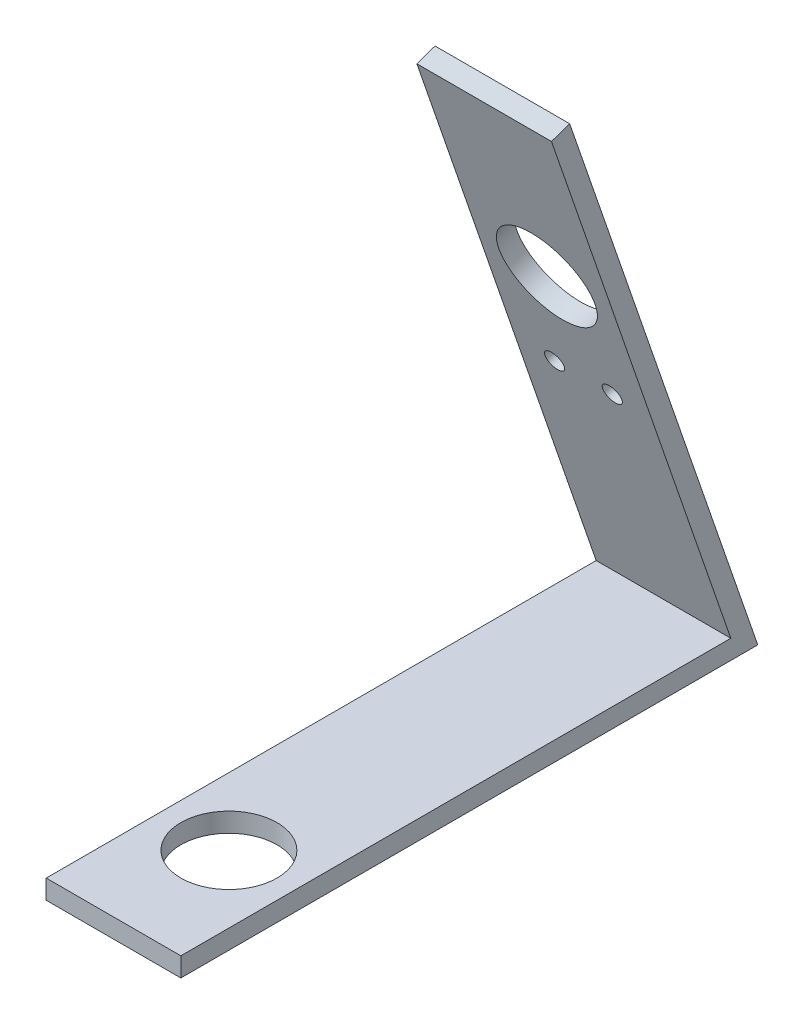
ISO-10303-21;
HEADER;
FILE_DESCRIPTION(('STEP AP214'),'2;1');
FILE_NAME('part.step','',(''),(''),'','','');
FILE_SCHEMA(('AUTOMOTIVE_DESIGN { 1 0 10303 214 1 1 1 1 }'));
ENDSEC;
DATA;
#1=APPLICATION_CONTEXT('core data for automotive mechanical design processes');
#2=APPLICATION_PROTOCOL_DEFINITION('international standard','automotive_design',2000,#1);
#3=PRODUCT_CONTEXT('',#1,'mechanical');
#4=PRODUCT('Part','Part','',(#3));
#5=PRODUCT_RELATED_PRODUCT_CATEGORY('part','',(#4));
#6=PRODUCT_DEFINITION_FORMATION('','',#4);
#7=PRODUCT_DEFINITION_CONTEXT('part definition',#1,'design');
#8=PRODUCT_DEFINITION('design','',#6,#7);
#9=PRODUCT_DEFINITION_SHAPE('','',#8);
#10=(LENGTH_UNIT() NAMED_UNIT(*) SI_UNIT(.MILLI.,.METRE.));
#11=(NAMED_UNIT(*) PLANE_ANGLE_UNIT() SI_UNIT($,.RADIAN.));
#12=(NAMED_UNIT(*) SI_UNIT($,.STERADIAN.) SOLID_ANGLE_UNIT());
#13=UNCERTAINTY_MEASURE_WITH_UNIT(LENGTH_MEASURE(1.E-05),#10,'distance_accuracy_value','');
#14=(GEOMETRIC_REPRESENTATION_CONTEXT(3) GLOBAL_UNCERTAINTY_ASSIGNED_CONTEXT((#13)) GLOBAL_UNIT_ASSIGNED_CONTEXT((#10,
#11,#12)) REPRESENTATION_CONTEXT('',''));
#15=CARTESIAN_POINT('',(0.,0.,0.));
#16=DIRECTION('',(0.,0.,1.));
#17=DIRECTION('',(1.,0.,0.));
#18=AXIS2_PLACEMENT_3D('',#15,#16,#17);
#19=CARTESIAN_POINT('',(70.,273.604393673125,83.7917053034565));
#20=DIRECTION('',(0.,-0.94534797891042,-0.326063182174842));
#21=DIRECTION('',(0.,0.326063182174842,-0.94534797891042));
#22=AXIS2_PLACEMENT_3D('',#19,#20,#21);
#23=PLANE('',#22);
#24=DIRECTION('',(0.,-0.326063182174842,0.94534797891042));
#25=VECTOR('',#24,1.);
#26=CARTESIAN_POINT('',(0.,273.604393673125,83.7917053034565));
#27=LINE('',#26,#25);
#28=CARTESIAN_POINT('',(0.,273.604393673125,83.7917053034565));
#29=VERTEX_POINT('',#28);
#30=CARTESIAN_POINT('',(0.,270.343761851377,93.2451850925606));
#31=VERTEX_POINT('',#30);
#32=EDGE_CURVE('E118',#29,#31,#27,.T.);
#33=ORIENTED_EDGE('',*,*,#32,.T.);
#34=DIRECTION('',(-1.,0.,0.));
#35=VECTOR('',#34,1.);
#36=CARTESIAN_POINT('',(70.,270.343761851377,93.2451850925606));
#37=LINE('',#36,#35);
#38=CARTESIAN_POINT('',(70.,270.343761851377,93.2451850925606));
#39=VERTEX_POINT('',#38);
#40=EDGE_CURVE('E11',#39,#31,#37,.T.);
#41=ORIENTED_EDGE('',*,*,#40,.F.);
#42=DIRECTION('',(0.,-0.326063182174842,0.94534797891042));
#43=VECTOR('',#42,1.);
#44=CARTESIAN_POINT('',(70.,273.604393673125,83.7917053034565));
#45=LINE('',#44,#43);
#46=CARTESIAN_POINT('',(70.,273.604393673125,83.7917053034565));
#47=VERTEX_POINT('',#46);
#48=EDGE_CURVE('E129',#47,#39,#45,.T.);
#49=ORIENTED_EDGE('',*,*,#48,.F.);
#50=DIRECTION('',(-1.,0.,0.));
#51=VECTOR('',#50,1.);
#52=CARTESIAN_POINT('',(70.,273.604393673125,83.7917053034565));
#53=LINE('',#52,#51);
#54=EDGE_CURVE('E114',#47,#29,#53,.T.);
#55=ORIENTED_EDGE('',*,*,#54,.T.);
#56=EDGE_LOOP('',(#33,#41,#49,#55));
#57=FACE_BOUND('',#56,.T.);
#58=ADVANCED_FACE('F33',(#57),#23,.F.);
#59=CARTESIAN_POINT('',(70.,270.343761851377,93.2451850925606));
#60=DIRECTION('',(0.,0.326063182174851,-0.945347978910417));
#61=DIRECTION('',(0.,0.945347978910417,0.326063182174851));
#62=AXIS2_PLACEMENT_3D('',#59,#60,#61);
#63=PLANE('',#62);
#64=CARTESIAN_POINT('',(50.,120.701549638956,41.631581435309));
#65=DIRECTION('',(0.,0.326063182174851,-0.945347978910417));
#66=DIRECTION('',(0.,0.945347978910417,0.326063182174851));
#67=AXIS2_PLACEMENT_3D('',#64,#65,#66);
#68=CIRCLE('',#67,5.00000000000001);
#69=CARTESIAN_POINT('',(50.,125.428289533508,43.2618973461833));
#70=VERTEX_POINT('',#69);
#71=EDGE_CURVE('E270',#70,#70,#68,.T.);
#72=ORIENTED_EDGE('',*,*,#71,.T.);
#73=EDGE_LOOP('',(#72));
#74=FACE_BOUND('',#73,.T.);
#75=CARTESIAN_POINT('',(20.,120.701549638956,41.631581435309));
#76=DIRECTION('',(0.,0.326063182174851,-0.945347978910417));
#77=DIRECTION('',(0.,0.945347978910417,0.326063182174851));
#78=AXIS2_PLACEMENT_3D('',#75,#76,#77);
#79=CIRCLE('',#78,5.00000000000001);
#80=CARTESIAN_POINT('',(20.,125.428289533508,43.2618973461833));
#81=VERTEX_POINT('',#80);
#82=EDGE_CURVE('E266',#81,#81,#79,.T.);
#83=ORIENTED_EDGE('',*,*,#82,.T.);
#84=EDGE_LOOP('',(#83));
#85=FACE_BOUND('',#84,.T.);
#86=CARTESIAN_POINT('',(35.,175.808963960335,60.6388668750755));
#87=DIRECTION('',(0.,0.326063182174851,-0.945347978910417));
#88=DIRECTION('',(0.,0.945347978910417,0.326063182174851));
#89=AXIS2_PLACEMENT_3D('',#86,#87,#88);
#90=CIRCLE('',#89,25.);
#91=CARTESIAN_POINT('',(35.,199.442663433095,68.7904464294468));
#92=VERTEX_POINT('',#91);
#93=EDGE_CURVE('E122',#92,#92,#90,.T.);
#94=ORIENTED_EDGE('',*,*,#93,.T.);
#95=EDGE_LOOP('',(#94));
#96=FACE_BOUND('',#95,.T.);
#97=DIRECTION('',(0.,-0.945347978910417,-0.326063182174851));
#98=VECTOR('',#97,1.);
#99=CARTESIAN_POINT('',(0.,270.343761851377,93.2451850925606));
#100=LINE('',#99,#98);
#101=CARTESIAN_POINT('',(0.,0.,0.));
#102=VERTEX_POINT('',#101);
#103=EDGE_CURVE('E121',#31,#102,#100,.T.);
#104=ORIENTED_EDGE('',*,*,#103,.T.);
#105=DIRECTION('',(-1.,0.,0.));
#106=VECTOR('',#105,1.);
#107=CARTESIAN_POINT('',(70.,0.,0.));
#108=LINE('',#107,#106);
#109=CARTESIAN_POINT('',(70.,0.,0.));
#110=VERTEX_POINT('',#109);
#111=EDGE_CURVE('E42',#110,#102,#108,.T.);
#112=ORIENTED_EDGE('',*,*,#111,.F.);
#113=DIRECTION('',(0.,-0.945347978910417,-0.326063182174851));
#114=VECTOR('',#113,1.);
#115=CARTESIAN_POINT('',(70.,270.343761851377,93.2451850925606));
#116=LINE('',#115,#114);
#117=EDGE_CURVE('E87',#39,#110,#116,.T.);
#118=ORIENTED_EDGE('',*,*,#117,.F.);
#119=ORIENTED_EDGE('',*,*,#40,.T.);
#120=EDGE_LOOP('',(#104,#112,#118,#119));
#121=FACE_BOUND('',#120,.T.);
#122=ADVANCED_FACE('F158',(#74,#85,#96,#121),#63,.F.);
#123=CARTESIAN_POINT('',(70.,0.,0.));
#124=DIRECTION('',(0.,-1.,0.));
#125=DIRECTION('',(0.,0.,-1.));
#126=AXIS2_PLACEMENT_3D('',#123,#124,#125);
#127=PLANE('',#126);
#128=CARTESIAN_POINT('',(35.,0.,225.972750651001));
#129=DIRECTION('',(0.,1.,0.));
#130=DIRECTION('',(0.,0.,1.));
#131=AXIS2_PLACEMENT_3D('',#128,#129,#130);
#132=CIRCLE('',#131,25.);
#133=CARTESIAN_POINT('',(35.,0.,250.972750651001));
#134=VERTEX_POINT('',#133);
#135=EDGE_CURVE('E260',#134,#134,#132,.T.);
#136=ORIENTED_EDGE('',*,*,#135,.F.);
#137=EDGE_LOOP('',(#136));
#138=FACE_BOUND('',#137,.T.);
#139=DIRECTION('',(0.,0.,1.));
#140=VECTOR('',#139,1.);
#141=CARTESIAN_POINT('',(0.,0.,0.));
#142=LINE('',#141,#140);
#143=CARTESIAN_POINT('',(0.,0.,285.972750651001));
#144=VERTEX_POINT('',#143);
#145=EDGE_CURVE('E124',#102,#144,#142,.T.);
#146=ORIENTED_EDGE('',*,*,#145,.T.);
#147=DIRECTION('',(-1.,0.,0.));
#148=VECTOR('',#147,1.);
#149=CARTESIAN_POINT('',(70.,0.,285.972750651001));
#150=LINE('',#149,#148);
#151=CARTESIAN_POINT('',(70.,0.,285.972750651001));
#152=VERTEX_POINT('',#151);
#153=EDGE_CURVE('E109',#152,#144,#150,.T.);
#154=ORIENTED_EDGE('',*,*,#153,.F.);
#155=DIRECTION('',(0.,0.,1.));
#156=VECTOR('',#155,1.);
#157=CARTESIAN_POINT('',(70.,0.,0.));
#158=LINE('',#157,#156);
#159=EDGE_CURVE('E100',#110,#152,#158,.T.);
#160=ORIENTED_EDGE('',*,*,#159,.F.);
#161=ORIENTED_EDGE('',*,*,#111,.T.);
#162=EDGE_LOOP('',(#146,#154,#160,#161));
#163=FACE_BOUND('',#162,.T.);
#164=ADVANCED_FACE('F136',(#138,#163),#127,.F.);
#165=CARTESIAN_POINT('',(70.,0.,285.972750651001));
#166=DIRECTION('',(0.,0.,-1.));
#167=DIRECTION('',(-1.,0.,0.));
#168=AXIS2_PLACEMENT_3D('',#165,#166,#167);
#169=PLANE('',#168);
#170=DIRECTION('',(0.,-1.,0.));
#171=VECTOR('',#170,1.);
#172=CARTESIAN_POINT('',(0.,0.,285.972750651001));
#173=LINE('',#172,#171);
#174=CARTESIAN_POINT('',(0.,-10.,285.972750651001));
#175=VERTEX_POINT('',#174);
#176=EDGE_CURVE('E108',#144,#175,#173,.T.);
#177=ORIENTED_EDGE('',*,*,#176,.T.);
#178=DIRECTION('',(-1.,0.,0.));
#179=VECTOR('',#178,1.);
#180=CARTESIAN_POINT('',(70.,-10.,285.972750651001));
#181=LINE('',#180,#179);
#182=CARTESIAN_POINT('',(70.,-10.,285.972750651001));
#183=VERTEX_POINT('',#182);
#184=EDGE_CURVE('E105',#183,#175,#181,.T.);
#185=ORIENTED_EDGE('',*,*,#184,.F.);
#186=DIRECTION('',(0.,-1.,0.));
#187=VECTOR('',#186,1.);
#188=CARTESIAN_POINT('',(70.,0.,285.972750651001));
#189=LINE('',#188,#187);
#190=EDGE_CURVE('E94',#152,#183,#189,.T.);
#191=ORIENTED_EDGE('',*,*,#190,.F.);
#192=ORIENTED_EDGE('',*,*,#153,.T.);
#193=EDGE_LOOP('',(#177,#185,#191,#192));
#194=FACE_BOUND('',#193,.T.);
#195=ADVANCED_FACE('F106',(#194),#169,.F.);
#196=CARTESIAN_POINT('',(70.,-10.,285.972750651001));
#197=DIRECTION('',(0.,1.,0.));
#198=DIRECTION('',(0.,0.,1.));
#199=AXIS2_PLACEMENT_3D('',#196,#197,#198);
#200=PLANE('',#199);
#201=CARTESIAN_POINT('',(35.,-10.,225.972750651001));
#202=DIRECTION('',(0.,1.,0.));
#203=DIRECTION('',(0.,0.,1.));
#204=AXIS2_PLACEMENT_3D('',#201,#202,#203);
#205=CIRCLE('',#204,25.);
#206=CARTESIAN_POINT('',(35.,-10.,250.972750651001));
#207=VERTEX_POINT('',#206);
#208=EDGE_CURVE('E36',#207,#207,#205,.T.);
#209=ORIENTED_EDGE('',*,*,#208,.T.);
#210=EDGE_LOOP('',(#209));
#211=FACE_BOUND('',#210,.T.);
#212=DIRECTION('',(0.,0.,-1.));
#213=VECTOR('',#212,1.);
#214=CARTESIAN_POINT('',(0.,-10.,285.972750651001));
#215=LINE('',#214,#213);
#216=CARTESIAN_POINT('',(0.,-10.,-14.0272493489988));
#217=VERTEX_POINT('',#216);
#218=EDGE_CURVE('E73',#175,#217,#215,.T.);
#219=ORIENTED_EDGE('',*,*,#218,.T.);
#220=DIRECTION('',(-1.,0.,0.));
#221=VECTOR('',#220,1.);
#222=CARTESIAN_POINT('',(70.,-10.,-14.0272493489988));
#223=LINE('',#222,#221);
#224=CARTESIAN_POINT('',(70.,-10.,-14.0272493489988));
#225=VERTEX_POINT('',#224);
#226=EDGE_CURVE('E110',#225,#217,#223,.T.);
#227=ORIENTED_EDGE('',*,*,#226,.F.);
#228=DIRECTION('',(0.,0.,-1.));
#229=VECTOR('',#228,1.);
#230=CARTESIAN_POINT('',(70.,-10.,285.972750651001));
#231=LINE('',#230,#229);
#232=EDGE_CURVE('E98',#183,#225,#231,.T.);
#233=ORIENTED_EDGE('',*,*,#232,.F.);
#234=ORIENTED_EDGE('',*,*,#184,.T.);
#235=EDGE_LOOP('',(#219,#227,#233,#234));
#236=FACE_BOUND('',#235,.T.);
#237=ADVANCED_FACE('F112',(#211,#236),#200,.F.);
#238=CARTESIAN_POINT('',(70.,-10.,-14.0272493489988));
#239=DIRECTION('',(0.,-0.326063182174851,0.945347978910417));
#240=DIRECTION('',(0.,-0.945347978910417,-0.326063182174851));
#241=AXIS2_PLACEMENT_3D('',#238,#239,#240);
#242=PLANE('',#241);
#243=CARTESIAN_POINT('',(50.,123.962181460705,32.1781016462048));
#244=DIRECTION('',(0.,0.326063182174851,-0.945347978910417));
#245=DIRECTION('',(0.,0.945347978910417,0.326063182174851));
#246=AXIS2_PLACEMENT_3D('',#243,#244,#245);
#247=CIRCLE('',#246,5.00000000000001);
#248=CARTESIAN_POINT('',(50.,128.688921355257,33.8084175570791));
#249=VERTEX_POINT('',#248);
#250=EDGE_CURVE('E267',#249,#249,#247,.T.);
#251=ORIENTED_EDGE('',*,*,#250,.F.);
#252=EDGE_LOOP('',(#251));
#253=FACE_BOUND('',#252,.T.);
#254=CARTESIAN_POINT('',(20.,123.962181460705,32.1781016462049));
#255=DIRECTION('',(0.,0.326063182174851,-0.945347978910417));
#256=DIRECTION('',(0.,0.945347978910417,0.326063182174851));
#257=AXIS2_PLACEMENT_3D('',#254,#255,#256);
#258=CIRCLE('',#257,5.00000000000001);
#259=CARTESIAN_POINT('',(20.,128.688921355257,33.8084175570791));
#260=VERTEX_POINT('',#259);
#261=EDGE_CURVE('E272',#260,#260,#258,.T.);
#262=ORIENTED_EDGE('',*,*,#261,.F.);
#263=EDGE_LOOP('',(#262));
#264=FACE_BOUND('',#263,.T.);
#265=CARTESIAN_POINT('',(35.,179.069595782083,51.1853870859714));
#266=DIRECTION('',(0.,0.326063182174851,-0.945347978910417));
#267=DIRECTION('',(0.,0.945347978910417,0.326063182174851));
#268=AXIS2_PLACEMENT_3D('',#265,#266,#267);
#269=CIRCLE('',#268,25.);
#270=CARTESIAN_POINT('',(35.,202.703295254844,59.3369666403426));
#271=VERTEX_POINT('',#270);
#272=EDGE_CURVE('E255',#271,#271,#269,.T.);
#273=ORIENTED_EDGE('',*,*,#272,.F.);
#274=EDGE_LOOP('',(#273));
#275=FACE_BOUND('',#274,.T.);
#276=DIRECTION('',(0.,0.945347978910417,0.326063182174851));
#277=VECTOR('',#276,1.);
#278=CARTESIAN_POINT('',(0.,-10.,-14.0272493489988));
#279=LINE('',#278,#277);
#280=EDGE_CURVE('E79',#217,#29,#279,.T.);
#281=ORIENTED_EDGE('',*,*,#280,.T.);
#282=ORIENTED_EDGE('',*,*,#54,.F.);
#283=DIRECTION('',(0.,0.945347978910417,0.326063182174851));
#284=VECTOR('',#283,1.);
#285=CARTESIAN_POINT('',(70.,-10.,-14.0272493489988));
#286=LINE('',#285,#284);
#287=EDGE_CURVE('E50',#225,#47,#286,.T.);
#288=ORIENTED_EDGE('',*,*,#287,.F.);
#289=ORIENTED_EDGE('',*,*,#226,.T.);
#290=EDGE_LOOP('',(#281,#282,#288,#289));
#291=FACE_BOUND('',#290,.T.);
#292=ADVANCED_FACE('F143',(#253,#264,#275,#291),#242,.F.);
#293=CARTESIAN_POINT('',(70.,0.,0.));
#294=DIRECTION('',(1.,0.,0.));
#295=DIRECTION('',(0.,0.,-1.));
#296=AXIS2_PLACEMENT_3D('',#293,#294,#295);
#297=PLANE('',#296);
#298=ORIENTED_EDGE('',*,*,#48,.T.);
#299=ORIENTED_EDGE('',*,*,#117,.T.);
#300=ORIENTED_EDGE('',*,*,#159,.T.);
#301=ORIENTED_EDGE('',*,*,#190,.T.);
#302=ORIENTED_EDGE('',*,*,#232,.T.);
#303=ORIENTED_EDGE('',*,*,#287,.T.);
#304=EDGE_LOOP('',(#298,#299,#300,#301,#302,#303));
#305=FACE_BOUND('',#304,.T.);
#306=ADVANCED_FACE('F96',(#305),#297,.T.);
#307=CARTESIAN_POINT('',(0.,0.,0.));
#308=DIRECTION('',(1.,0.,0.));
#309=DIRECTION('',(0.,0.,-1.));
#310=AXIS2_PLACEMENT_3D('',#307,#308,#309);
#311=PLANE('',#310);
#312=ORIENTED_EDGE('',*,*,#32,.F.);
#313=ORIENTED_EDGE('',*,*,#280,.F.);
#314=ORIENTED_EDGE('',*,*,#218,.F.);
#315=ORIENTED_EDGE('',*,*,#176,.F.);
#316=ORIENTED_EDGE('',*,*,#145,.F.);
#317=ORIENTED_EDGE('',*,*,#103,.F.);
#318=EDGE_LOOP('',(#312,#313,#314,#315,#316,#317));
#319=FACE_BOUND('',#318,.T.);
#320=ADVANCED_FACE('F139',(#319),#311,.F.);
#321=CARTESIAN_POINT('',(35.,175.808963960335,60.6388668750755));
#322=DIRECTION('',(0.,0.326063182174851,-0.945347978910417));
#323=DIRECTION('',(0.,0.945347978910417,0.326063182174851));
#324=AXIS2_PLACEMENT_3D('',#321,#322,#323);
#325=CYLINDRICAL_SURFACE('',#324,25.);
#326=ORIENTED_EDGE('',*,*,#93,.F.);
#327=EDGE_LOOP('',(#326));
#328=FACE_BOUND('',#327,.T.);
#329=ORIENTED_EDGE('',*,*,#272,.T.);
#330=EDGE_LOOP('',(#329));
#331=FACE_BOUND('',#330,.T.);
#332=ADVANCED_FACE('F195',(#328,#331),#325,.F.);
#333=CARTESIAN_POINT('',(35.,-300.,225.972750651001));
#334=DIRECTION('',(0.,1.,0.));
#335=DIRECTION('',(0.,0.,1.));
#336=AXIS2_PLACEMENT_3D('',#333,#334,#335);
#337=CYLINDRICAL_SURFACE('',#336,25.);
#338=ORIENTED_EDGE('',*,*,#135,.T.);
#339=EDGE_LOOP('',(#338));
#340=FACE_BOUND('',#339,.T.);
#341=ORIENTED_EDGE('',*,*,#208,.F.);
#342=EDGE_LOOP('',(#341));
#343=FACE_BOUND('',#342,.T.);
#344=ADVANCED_FACE('F190',(#340,#343),#337,.F.);
#345=CARTESIAN_POINT('',(20.,120.701549638956,41.631581435309));
#346=DIRECTION('',(0.,0.326063182174851,-0.945347978910417));
#347=DIRECTION('',(0.,0.945347978910417,0.326063182174851));
#348=AXIS2_PLACEMENT_3D('',#345,#346,#347);
#349=CYLINDRICAL_SURFACE('',#348,5.00000000000001);
#350=ORIENTED_EDGE('',*,*,#82,.F.);
#351=EDGE_LOOP('',(#350));
#352=FACE_BOUND('',#351,.T.);
#353=ORIENTED_EDGE('',*,*,#261,.T.);
#354=EDGE_LOOP('',(#353));
#355=FACE_BOUND('',#354,.T.);
#356=ADVANCED_FACE('F194',(#352,#355),#349,.F.);
#357=CARTESIAN_POINT('',(50.,120.701549638956,41.631581435309));
#358=DIRECTION('',(0.,0.326063182174851,-0.945347978910417));
#359=DIRECTION('',(0.,0.945347978910417,0.326063182174851));
#360=AXIS2_PLACEMENT_3D('',#357,#358,#359);
#361=CYLINDRICAL_SURFACE('',#360,5.00000000000001);
#362=ORIENTED_EDGE('',*,*,#71,.F.);
#363=EDGE_LOOP('',(#362));
#364=FACE_BOUND('',#363,.T.);
#365=ORIENTED_EDGE('',*,*,#250,.T.);
#366=EDGE_LOOP('',(#365));
#367=FACE_BOUND('',#366,.T.);
#368=ADVANCED_FACE('F217',(#364,#367),#361,.F.);
#369=CLOSED_SHELL('',(#58,#122,#164,#195,#237,#292,#306,#320,#332,#344,#356,#368));
#370=MANIFOLD_SOLID_BREP('B2',#369);
#371=ADVANCED_BREP_SHAPE_REPRESENTATION('',(#18,#370),#14);
#372=SHAPE_DEFINITION_REPRESENTATION(#9,#371);
ENDSEC;
END-ISO-10303-21;
